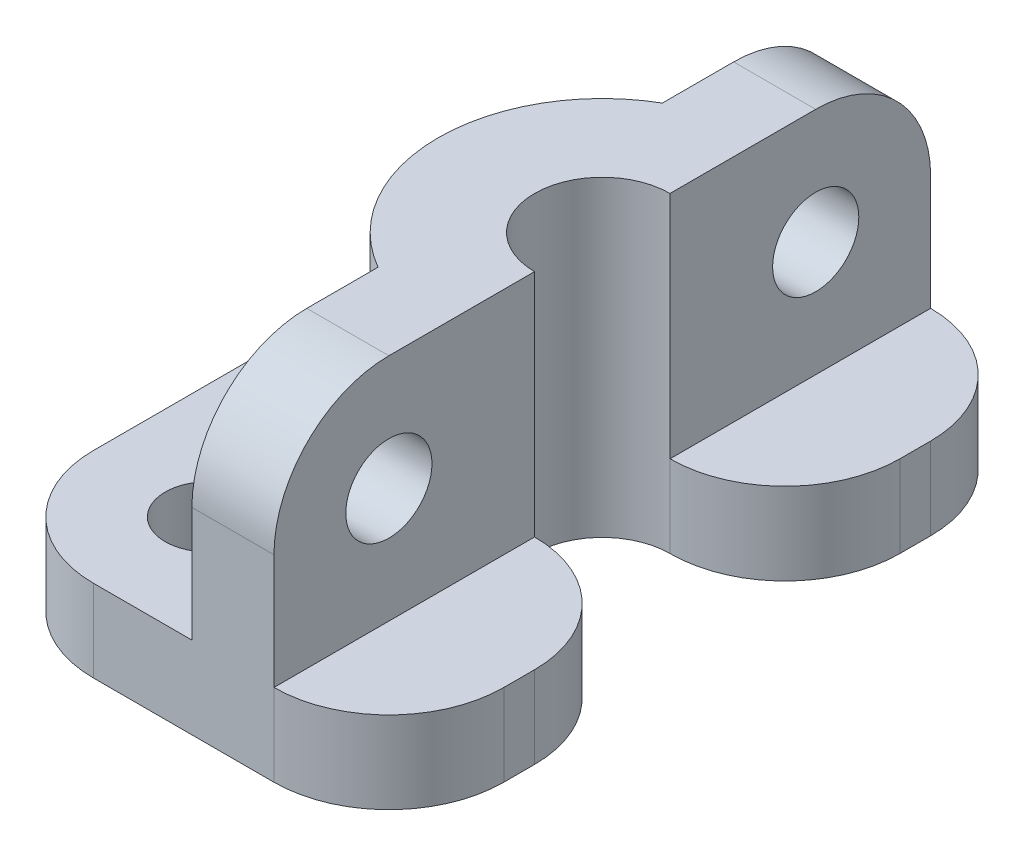
ISO-10303-21;
HEADER;
FILE_DESCRIPTION(('STEP AP214'),'2;1');
FILE_NAME('part.step','',(''),(''),'','','');
FILE_SCHEMA(('AUTOMOTIVE_DESIGN { 1 0 10303 214 1 1 1 1 }'));
ENDSEC;
DATA;
#1=APPLICATION_CONTEXT('core data for automotive mechanical design processes');
#2=APPLICATION_PROTOCOL_DEFINITION('international standard','automotive_design',2000,#1);
#3=PRODUCT_CONTEXT('',#1,'mechanical');
#4=PRODUCT('Part','Part','',(#3));
#5=PRODUCT_RELATED_PRODUCT_CATEGORY('part','',(#4));
#6=PRODUCT_DEFINITION_FORMATION('','',#4);
#7=PRODUCT_DEFINITION_CONTEXT('part definition',#1,'design');
#8=PRODUCT_DEFINITION('design','',#6,#7);
#9=PRODUCT_DEFINITION_SHAPE('','',#8);
#10=(LENGTH_UNIT() NAMED_UNIT(*) SI_UNIT(.MILLI.,.METRE.));
#11=(NAMED_UNIT(*) PLANE_ANGLE_UNIT() SI_UNIT($,.RADIAN.));
#12=(NAMED_UNIT(*) SI_UNIT($,.STERADIAN.) SOLID_ANGLE_UNIT());
#13=UNCERTAINTY_MEASURE_WITH_UNIT(LENGTH_MEASURE(1.E-05),#10,'distance_accuracy_value','');
#14=(GEOMETRIC_REPRESENTATION_CONTEXT(3) GLOBAL_UNCERTAINTY_ASSIGNED_CONTEXT((#13)) GLOBAL_UNIT_ASSIGNED_CONTEXT((#10,
#11,#12)) REPRESENTATION_CONTEXT('',''));
#15=CARTESIAN_POINT('',(0.,0.,0.));
#16=DIRECTION('',(0.,0.,1.));
#17=DIRECTION('',(1.,0.,0.));
#18=AXIS2_PLACEMENT_3D('',#15,#16,#17);
#19=CARTESIAN_POINT('',(9.,5.,20.));
#20=DIRECTION('',(0.,1.,0.));
#21=DIRECTION('',(0.,0.,1.));
#22=AXIS2_PLACEMENT_3D('',#19,#20,#21);
#23=PLANE('',#22);
#24=CARTESIAN_POINT('',(-2.,5.,-13.));
#25=DIRECTION('',(0.,1.,0.));
#26=DIRECTION('',(0.,0.,1.));
#27=AXIS2_PLACEMENT_3D('',#24,#25,#26);
#28=CIRCLE('',#27,2.625);
#29=CARTESIAN_POINT('',(-2.,5.,-10.375));
#30=VERTEX_POINT('',#29);
#31=EDGE_CURVE('E261',#30,#30,#28,.T.);
#32=ORIENTED_EDGE('',*,*,#31,.F.);
#33=EDGE_LOOP('',(#32));
#34=FACE_BOUND('',#33,.T.);
#35=DIRECTION('',(0.,0.,1.));
#36=VECTOR('',#35,1.);
#37=CARTESIAN_POINT('',(-9.,5.,-20.));
#38=LINE('',#37,#36);
#39=CARTESIAN_POINT('',(-9.,5.,-13.));
#40=VERTEX_POINT('',#39);
#41=CARTESIAN_POINT('',(-9.,5.,-2.5));
#42=VERTEX_POINT('',#41);
#43=EDGE_CURVE('E219',#40,#42,#38,.T.);
#44=ORIENTED_EDGE('',*,*,#43,.T.);
#45=DIRECTION('',(1.,0.,0.));
#46=VECTOR('',#45,1.);
#47=CARTESIAN_POINT('',(2.,5.,-2.5));
#48=LINE('',#47,#46);
#49=CARTESIAN_POINT('',(-0.682458365518541,5.,-2.5));
#50=VERTEX_POINT('',#49);
#51=EDGE_CURVE('E193',#42,#50,#48,.T.);
#52=ORIENTED_EDGE('',*,*,#51,.T.);
#53=CARTESIAN_POINT('',(9.,5.,0.));
#54=DIRECTION('',(0.,1.,0.));
#55=DIRECTION('',(0.,0.,1.));
#56=AXIS2_PLACEMENT_3D('',#53,#54,#55);
#57=CIRCLE('',#56,10.);
#58=CARTESIAN_POINT('',(4.00000000000001,5.,-8.66025403784439));
#59=VERTEX_POINT('',#58);
#60=EDGE_CURVE('E321',#59,#50,#57,.T.);
#61=ORIENTED_EDGE('',*,*,#60,.F.);
#62=DIRECTION('',(0.,0.,1.));
#63=VECTOR('',#62,1.);
#64=CARTESIAN_POINT('',(4.,5.,-20.));
#65=LINE('',#64,#63);
#66=CARTESIAN_POINT('',(4.00000000000001,5.,-20.));
#67=VERTEX_POINT('',#66);
#68=EDGE_CURVE('E308',#67,#59,#65,.T.);
#69=ORIENTED_EDGE('',*,*,#68,.F.);
#70=DIRECTION('',(-1.,0.,0.));
#71=VECTOR('',#70,1.);
#72=CARTESIAN_POINT('',(-9.,5.,-20.));
#73=LINE('',#72,#71);
#74=CARTESIAN_POINT('',(-2.,5.,-20.));
#75=VERTEX_POINT('',#74);
#76=EDGE_CURVE('E220',#67,#75,#73,.T.);
#77=ORIENTED_EDGE('',*,*,#76,.T.);
#78=CARTESIAN_POINT('',(-2.,5.,-13.));
#79=DIRECTION('',(0.,1.,0.));
#80=DIRECTION('',(0.,0.,1.));
#81=AXIS2_PLACEMENT_3D('',#78,#79,#80);
#82=CIRCLE('',#81,7.);
#83=EDGE_CURVE('E241',#75,#40,#82,.T.);
#84=ORIENTED_EDGE('',*,*,#83,.T.);
#85=EDGE_LOOP('',(#44,#52,#61,#69,#77,#84));
#86=FACE_BOUND('',#85,.T.);
#87=ADVANCED_FACE('F35',(#34,#86),#23,.T.);
#88=CARTESIAN_POINT('',(9.,19.,0.));
#89=DIRECTION('',(0.,-1.,0.));
#90=DIRECTION('',(0.,0.,-1.));
#91=AXIS2_PLACEMENT_3D('',#88,#89,#90);
#92=CYLINDRICAL_SURFACE('',#91,10.);
#93=DIRECTION('',(0.,-1.,0.));
#94=VECTOR('',#93,1.);
#95=CARTESIAN_POINT('',(-0.682458365518541,19.,-2.5));
#96=LINE('',#95,#94);
#97=CARTESIAN_POINT('',(-0.68245836551854,13.3175416344814,-2.5));
#98=VERTEX_POINT('',#97);
#99=EDGE_CURVE('E11',#98,#50,#96,.T.);
#100=ORIENTED_EDGE('',*,*,#99,.F.);
#101=CARTESIAN_POINT('',(9.,22.9999999999998,0.));
#102=DIRECTION('',(-0.707106781186544,0.707106781186551,0.));
#103=DIRECTION('',(-0.707106781186551,-0.707106781186544,0.));
#104=AXIS2_PLACEMENT_3D('',#101,#102,#103);
#105=ELLIPSE('',#104,14.1421356237309,10.);
#106=CARTESIAN_POINT('',(-0.68245836551854,13.3175416344814,2.5));
#107=VERTEX_POINT('',#106);
#108=EDGE_CURVE('E43',#98,#107,#105,.T.);
#109=ORIENTED_EDGE('',*,*,#108,.T.);
#110=DIRECTION('',(0.,-1.,0.));
#111=VECTOR('',#110,1.);
#112=CARTESIAN_POINT('',(-0.682458365518541,19.,2.5));
#113=LINE('',#112,#111);
#114=CARTESIAN_POINT('',(-0.682458365518541,5.,2.5));
#115=VERTEX_POINT('',#114);
#116=EDGE_CURVE('E190',#107,#115,#113,.T.);
#117=ORIENTED_EDGE('',*,*,#116,.T.);
#118=CARTESIAN_POINT('',(4.00000000000001,5.,8.66025403784439));
#119=VERTEX_POINT('',#118);
#120=EDGE_CURVE('E213',#115,#119,#57,.T.);
#121=ORIENTED_EDGE('',*,*,#120,.T.);
#122=DIRECTION('',(0.,-1.,0.));
#123=VECTOR('',#122,1.);
#124=CARTESIAN_POINT('',(4.00000000000001,19.,8.66025403784439));
#125=LINE('',#124,#123);
#126=CARTESIAN_POINT('',(4.00000000000001,19.,8.66025403784439));
#127=VERTEX_POINT('',#126);
#128=EDGE_CURVE('E326',#127,#119,#125,.T.);
#129=ORIENTED_EDGE('',*,*,#128,.F.);
#130=CARTESIAN_POINT('',(9.,19.,0.));
#131=DIRECTION('',(0.,1.,0.));
#132=DIRECTION('',(0.,0.,1.));
#133=AXIS2_PLACEMENT_3D('',#130,#131,#132);
#134=CIRCLE('',#133,10.);
#135=CARTESIAN_POINT('',(4.00000000000001,19.,-8.66025403784439));
#136=VERTEX_POINT('',#135);
#137=EDGE_CURVE('E315',#136,#127,#134,.T.);
#138=ORIENTED_EDGE('',*,*,#137,.F.);
#139=DIRECTION('',(0.,-1.,0.));
#140=VECTOR('',#139,1.);
#141=CARTESIAN_POINT('',(4.00000000000001,19.,-8.66025403784439));
#142=LINE('',#141,#140);
#143=EDGE_CURVE('E350',#136,#59,#142,.T.);
#144=ORIENTED_EDGE('',*,*,#143,.T.);
#145=ORIENTED_EDGE('',*,*,#60,.T.);
#146=EDGE_LOOP('',(#100,#109,#117,#121,#129,#138,#144,#145));
#147=FACE_BOUND('',#146,.T.);
#148=ADVANCED_FACE('F250',(#147),#92,.T.);
#149=CARTESIAN_POINT('',(9.,5.,-20.));
#150=DIRECTION('',(-1.,0.,0.));
#151=DIRECTION('',(0.,0.,1.));
#152=AXIS2_PLACEMENT_3D('',#149,#150,#151);
#153=PLANE('',#152);
#154=CARTESIAN_POINT('',(9.,12.,-13.));
#155=DIRECTION('',(1.,0.,0.));
#156=DIRECTION('',(0.,0.,1.));
#157=AXIS2_PLACEMENT_3D('',#154,#155,#156);
#158=CIRCLE('',#157,2.625);
#159=CARTESIAN_POINT('',(9.,12.,-10.375));
#160=VERTEX_POINT('',#159);
#161=EDGE_CURVE('E288',#160,#160,#158,.T.);
#162=ORIENTED_EDGE('',*,*,#161,.F.);
#163=EDGE_LOOP('',(#162));
#164=FACE_BOUND('',#163,.T.);
#165=DIRECTION('',(0.,0.,1.));
#166=VECTOR('',#165,1.);
#167=CARTESIAN_POINT('',(9.,5.,-20.));
#168=LINE('',#167,#166);
#169=CARTESIAN_POINT('',(9.,5.,-20.));
#170=VERTEX_POINT('',#169);
#171=CARTESIAN_POINT('',(9.,5.,-4.125));
#172=VERTEX_POINT('',#171);
#173=EDGE_CURVE('E267',#170,#172,#168,.T.);
#174=ORIENTED_EDGE('',*,*,#173,.F.);
#175=DIRECTION('',(0.,-1.,0.));
#176=VECTOR('',#175,1.);
#177=CARTESIAN_POINT('',(9.,5.,-20.));
#178=LINE('',#177,#176);
#179=CARTESIAN_POINT('',(9.,12.,-20.));
#180=VERTEX_POINT('',#179);
#181=EDGE_CURVE('E423',#180,#170,#178,.T.);
#182=ORIENTED_EDGE('',*,*,#181,.F.);
#183=CARTESIAN_POINT('',(9.,12.,-13.));
#184=DIRECTION('',(-1.,0.,0.));
#185=DIRECTION('',(0.,0.,1.));
#186=AXIS2_PLACEMENT_3D('',#183,#184,#185);
#187=CIRCLE('',#186,7.);
#188=CARTESIAN_POINT('',(9.,19.,-13.));
#189=VERTEX_POINT('',#188);
#190=EDGE_CURVE('E354',#180,#189,#187,.F.);
#191=ORIENTED_EDGE('',*,*,#190,.T.);
#192=DIRECTION('',(0.,0.,-1.));
#193=VECTOR('',#192,1.);
#194=CARTESIAN_POINT('',(9.,19.,20.));
#195=LINE('',#194,#193);
#196=CARTESIAN_POINT('',(9.,19.,-4.125));
#197=VERTEX_POINT('',#196);
#198=EDGE_CURVE('E313',#197,#189,#195,.T.);
#199=ORIENTED_EDGE('',*,*,#198,.F.);
#200=DIRECTION('',(0.,1.,0.));
#201=VECTOR('',#200,1.);
#202=CARTESIAN_POINT('',(9.,0.,-4.125));
#203=LINE('',#202,#201);
#204=EDGE_CURVE('E301',#197,#172,#203,.F.);
#205=ORIENTED_EDGE('',*,*,#204,.T.);
#206=EDGE_LOOP('',(#174,#182,#191,#199,#205));
#207=FACE_BOUND('',#206,.T.);
#208=ADVANCED_FACE('F459',(#164,#207),#153,.F.);
#209=CARTESIAN_POINT('',(9.,12.,13.));
#210=DIRECTION('',(1.,0.,0.));
#211=DIRECTION('',(0.,0.,-1.));
#212=AXIS2_PLACEMENT_3D('',#209,#210,#211);
#213=CIRCLE('',#212,2.625);
#214=CARTESIAN_POINT('',(9.,12.,10.375));
#215=VERTEX_POINT('',#214);
#216=EDGE_CURVE('E294',#215,#215,#213,.T.);
#217=ORIENTED_EDGE('',*,*,#216,.F.);
#218=EDGE_LOOP('',(#217));
#219=FACE_BOUND('',#218,.T.);
#220=DIRECTION('',(0.,0.,1.));
#221=VECTOR('',#220,1.);
#222=CARTESIAN_POINT('',(9.00000000000001,5.,20.));
#223=LINE('',#222,#221);
#224=CARTESIAN_POINT('',(9.,5.,4.12500000000002));
#225=VERTEX_POINT('',#224);
#226=CARTESIAN_POINT('',(9.,5.,20.));
#227=VERTEX_POINT('',#226);
#228=EDGE_CURVE('E277',#225,#227,#223,.T.);
#229=ORIENTED_EDGE('',*,*,#228,.F.);
#230=DIRECTION('',(0.,1.,0.));
#231=VECTOR('',#230,1.);
#232=CARTESIAN_POINT('',(9.,0.,4.125));
#233=LINE('',#232,#231);
#234=CARTESIAN_POINT('',(9.,19.,4.125));
#235=VERTEX_POINT('',#234);
#236=EDGE_CURVE('E304',#225,#235,#233,.T.);
#237=ORIENTED_EDGE('',*,*,#236,.T.);
#238=CARTESIAN_POINT('',(9.,19.,13.));
#239=VERTEX_POINT('',#238);
#240=EDGE_CURVE('E309',#239,#235,#195,.T.);
#241=ORIENTED_EDGE('',*,*,#240,.F.);
#242=CARTESIAN_POINT('',(9.,12.,13.));
#243=DIRECTION('',(-1.,0.,0.));
#244=DIRECTION('',(0.,0.,1.));
#245=AXIS2_PLACEMENT_3D('',#242,#243,#244);
#246=CIRCLE('',#245,7.);
#247=CARTESIAN_POINT('',(9.,12.,20.));
#248=VERTEX_POINT('',#247);
#249=EDGE_CURVE('E341',#239,#248,#246,.F.);
#250=ORIENTED_EDGE('',*,*,#249,.T.);
#251=DIRECTION('',(0.,-1.,0.));
#252=VECTOR('',#251,1.);
#253=CARTESIAN_POINT('',(9.,5.,20.));
#254=LINE('',#253,#252);
#255=EDGE_CURVE('E237',#248,#227,#254,.T.);
#256=ORIENTED_EDGE('',*,*,#255,.T.);
#257=EDGE_LOOP('',(#229,#237,#241,#250,#256));
#258=FACE_BOUND('',#257,.T.);
#259=ADVANCED_FACE('F528',(#219,#258),#153,.F.);
#260=CARTESIAN_POINT('',(-9.,5.,-20.));
#261=DIRECTION('',(0.,0.,1.));
#262=DIRECTION('',(1.,0.,0.));
#263=AXIS2_PLACEMENT_3D('',#260,#261,#262);
#264=PLANE('',#263);
#265=DIRECTION('',(-1.,0.,0.));
#266=VECTOR('',#265,1.);
#267=CARTESIAN_POINT('',(-9.,0.,-20.));
#268=LINE('',#267,#266);
#269=CARTESIAN_POINT('',(9.,0.,-20.));
#270=VERTEX_POINT('',#269);
#271=CARTESIAN_POINT('',(-2.,0.,-20.));
#272=VERTEX_POINT('',#271);
#273=EDGE_CURVE('E232',#270,#272,#268,.T.);
#274=ORIENTED_EDGE('',*,*,#273,.T.);
#275=DIRECTION('',(0.,-1.,0.));
#276=VECTOR('',#275,1.);
#277=CARTESIAN_POINT('',(-2.,5.,-20.));
#278=LINE('',#277,#276);
#279=EDGE_CURVE('E238',#272,#75,#278,.F.);
#280=ORIENTED_EDGE('',*,*,#279,.T.);
#281=ORIENTED_EDGE('',*,*,#76,.F.);
#282=DIRECTION('',(0.,-1.,0.));
#283=VECTOR('',#282,1.);
#284=CARTESIAN_POINT('',(4.,19.,-20.));
#285=LINE('',#284,#283);
#286=CARTESIAN_POINT('',(4.,12.,-20.));
#287=VERTEX_POINT('',#286);
#288=EDGE_CURVE('E348',#287,#67,#285,.T.);
#289=ORIENTED_EDGE('',*,*,#288,.F.);
#290=DIRECTION('',(-1.,0.,0.));
#291=VECTOR('',#290,1.);
#292=CARTESIAN_POINT('',(9.,12.,-20.));
#293=LINE('',#292,#291);
#294=EDGE_CURVE('E352',#287,#180,#293,.F.);
#295=ORIENTED_EDGE('',*,*,#294,.T.);
#296=ORIENTED_EDGE('',*,*,#181,.T.);
#297=DIRECTION('',(0.,1.,0.));
#298=VECTOR('',#297,1.);
#299=CARTESIAN_POINT('',(9.,5.,-20.));
#300=LINE('',#299,#298);
#301=EDGE_CURVE('E395',#170,#270,#300,.F.);
#302=ORIENTED_EDGE('',*,*,#301,.T.);
#303=EDGE_LOOP('',(#274,#280,#281,#289,#295,#296,#302));
#304=FACE_BOUND('',#303,.T.);
#305=ADVANCED_FACE('F403',(#304),#264,.F.);
#306=CARTESIAN_POINT('',(-9.,5.,-20.));
#307=DIRECTION('',(1.,0.,0.));
#308=DIRECTION('',(0.,0.,-1.));
#309=AXIS2_PLACEMENT_3D('',#306,#307,#308);
#310=PLANE('',#309);
#311=ORIENTED_EDGE('',*,*,#43,.F.);
#312=DIRECTION('',(0.,-1.,0.));
#313=VECTOR('',#312,1.);
#314=CARTESIAN_POINT('',(-9.,5.,-13.));
#315=LINE('',#314,#313);
#316=CARTESIAN_POINT('',(-9.,0.,-13.));
#317=VERTEX_POINT('',#316);
#318=EDGE_CURVE('E393',#40,#317,#315,.T.);
#319=ORIENTED_EDGE('',*,*,#318,.T.);
#320=DIRECTION('',(0.,0.,1.));
#321=VECTOR('',#320,1.);
#322=CARTESIAN_POINT('',(-9.,0.,-20.));
#323=LINE('',#322,#321);
#324=CARTESIAN_POINT('',(-9.,0.,13.));
#325=VERTEX_POINT('',#324);
#326=EDGE_CURVE('E413',#317,#325,#323,.T.);
#327=ORIENTED_EDGE('',*,*,#326,.T.);
#328=DIRECTION('',(0.,-1.,0.));
#329=VECTOR('',#328,1.);
#330=CARTESIAN_POINT('',(-9.,5.,13.));
#331=LINE('',#330,#329);
#332=CARTESIAN_POINT('',(-9.,5.,13.));
#333=VERTEX_POINT('',#332);
#334=EDGE_CURVE('E218',#325,#333,#331,.F.);
#335=ORIENTED_EDGE('',*,*,#334,.T.);
#336=CARTESIAN_POINT('',(-9.,5.,2.5));
#337=VERTEX_POINT('',#336);
#338=EDGE_CURVE('E210',#337,#333,#38,.T.);
#339=ORIENTED_EDGE('',*,*,#338,.F.);
#340=DIRECTION('',(0.,0.,1.));
#341=VECTOR('',#340,1.);
#342=CARTESIAN_POINT('',(-9.,5.,-2.5));
#343=LINE('',#342,#341);
#344=EDGE_CURVE('E196',#42,#337,#343,.T.);
#345=ORIENTED_EDGE('',*,*,#344,.F.);
#346=EDGE_LOOP('',(#311,#319,#327,#335,#339,#345));
#347=FACE_BOUND('',#346,.T.);
#348=ADVANCED_FACE('F215',(#347),#310,.F.);
#349=CARTESIAN_POINT('',(-9.,5.,20.));
#350=DIRECTION('',(0.,0.,-1.));
#351=DIRECTION('',(-1.,0.,0.));
#352=AXIS2_PLACEMENT_3D('',#349,#350,#351);
#353=PLANE('',#352);
#354=DIRECTION('',(1.,0.,0.));
#355=VECTOR('',#354,1.);
#356=CARTESIAN_POINT('',(-9.,0.,20.));
#357=LINE('',#356,#355);
#358=CARTESIAN_POINT('',(-2.,0.,20.));
#359=VERTEX_POINT('',#358);
#360=CARTESIAN_POINT('',(9.,0.,20.));
#361=VERTEX_POINT('',#360);
#362=EDGE_CURVE('E224',#359,#361,#357,.T.);
#363=ORIENTED_EDGE('',*,*,#362,.T.);
#364=DIRECTION('',(0.,-1.,0.));
#365=VECTOR('',#364,1.);
#366=CARTESIAN_POINT('',(9.,5.,20.));
#367=LINE('',#366,#365);
#368=EDGE_CURVE('E246',#361,#227,#367,.F.);
#369=ORIENTED_EDGE('',*,*,#368,.T.);
#370=ORIENTED_EDGE('',*,*,#255,.F.);
#371=DIRECTION('',(1.,0.,0.));
#372=VECTOR('',#371,1.);
#373=CARTESIAN_POINT('',(4.00000000000001,12.,20.));
#374=LINE('',#373,#372);
#375=CARTESIAN_POINT('',(4.00000000000001,12.,20.));
#376=VERTEX_POINT('',#375);
#377=EDGE_CURVE('E343',#248,#376,#374,.F.);
#378=ORIENTED_EDGE('',*,*,#377,.T.);
#379=DIRECTION('',(0.,-1.,0.));
#380=VECTOR('',#379,1.);
#381=CARTESIAN_POINT('',(4.00000000000001,19.,20.));
#382=LINE('',#381,#380);
#383=CARTESIAN_POINT('',(4.00000000000001,5.,20.));
#384=VERTEX_POINT('',#383);
#385=EDGE_CURVE('E320',#376,#384,#382,.T.);
#386=ORIENTED_EDGE('',*,*,#385,.T.);
#387=DIRECTION('',(1.,0.,0.));
#388=VECTOR('',#387,1.);
#389=CARTESIAN_POINT('',(-9.,5.,20.));
#390=LINE('',#389,#388);
#391=CARTESIAN_POINT('',(-2.,5.,20.));
#392=VERTEX_POINT('',#391);
#393=EDGE_CURVE('E222',#392,#384,#390,.T.);
#394=ORIENTED_EDGE('',*,*,#393,.F.);
#395=DIRECTION('',(0.,-1.,0.));
#396=VECTOR('',#395,1.);
#397=CARTESIAN_POINT('',(-2.,5.,20.));
#398=LINE('',#397,#396);
#399=EDGE_CURVE('E243',#392,#359,#398,.T.);
#400=ORIENTED_EDGE('',*,*,#399,.T.);
#401=EDGE_LOOP('',(#363,#369,#370,#378,#386,#394,#400));
#402=FACE_BOUND('',#401,.T.);
#403=ADVANCED_FACE('F488',(#402),#353,.F.);
#404=DIRECTION('',(1.,0.,0.));
#405=VECTOR('',#404,1.);
#406=CARTESIAN_POINT('',(2.,5.,2.5));
#407=LINE('',#406,#405);
#408=EDGE_CURVE('E50',#337,#115,#407,.T.);
#409=ORIENTED_EDGE('',*,*,#408,.F.);
#410=ORIENTED_EDGE('',*,*,#338,.T.);
#411=CARTESIAN_POINT('',(-2.,5.,13.));
#412=DIRECTION('',(0.,1.,0.));
#413=DIRECTION('',(0.,0.,1.));
#414=AXIS2_PLACEMENT_3D('',#411,#412,#413);
#415=CIRCLE('',#414,7.);
#416=EDGE_CURVE('E58',#333,#392,#415,.T.);
#417=ORIENTED_EDGE('',*,*,#416,.T.);
#418=ORIENTED_EDGE('',*,*,#393,.T.);
#419=DIRECTION('',(0.,0.,1.));
#420=VECTOR('',#419,1.);
#421=CARTESIAN_POINT('',(4.00000000000001,5.,20.));
#422=LINE('',#421,#420);
#423=EDGE_CURVE('E323',#119,#384,#422,.T.);
#424=ORIENTED_EDGE('',*,*,#423,.F.);
#425=ORIENTED_EDGE('',*,*,#120,.F.);
#426=EDGE_LOOP('',(#409,#410,#417,#418,#424,#425));
#427=FACE_BOUND('',#426,.T.);
#428=CARTESIAN_POINT('',(-2.,5.,13.));
#429=DIRECTION('',(0.,1.,0.));
#430=DIRECTION('',(0.,0.,-1.));
#431=AXIS2_PLACEMENT_3D('',#428,#429,#430);
#432=CIRCLE('',#431,2.625);
#433=CARTESIAN_POINT('',(-2.,5.,10.375));
#434=VERTEX_POINT('',#433);
#435=EDGE_CURVE('E205',#434,#434,#432,.T.);
#436=ORIENTED_EDGE('',*,*,#435,.F.);
#437=EDGE_LOOP('',(#436));
#438=FACE_BOUND('',#437,.T.);
#439=ADVANCED_FACE('F208',(#427,#438),#23,.T.);
#440=CARTESIAN_POINT('',(9.,0.,20.));
#441=DIRECTION('',(0.,1.,0.));
#442=DIRECTION('',(0.,0.,1.));
#443=AXIS2_PLACEMENT_3D('',#440,#441,#442);
#444=PLANE('',#443);
#445=CARTESIAN_POINT('',(-2.,0.,13.));
#446=DIRECTION('',(0.,1.,0.));
#447=DIRECTION('',(0.,0.,-1.));
#448=AXIS2_PLACEMENT_3D('',#445,#446,#447);
#449=CIRCLE('',#448,2.625);
#450=CARTESIAN_POINT('',(-2.,0.,10.375));
#451=VERTEX_POINT('',#450);
#452=EDGE_CURVE('E258',#451,#451,#449,.T.);
#453=ORIENTED_EDGE('',*,*,#452,.T.);
#454=EDGE_LOOP('',(#453));
#455=FACE_BOUND('',#454,.T.);
#456=CARTESIAN_POINT('',(-2.,0.,-13.));
#457=DIRECTION('',(0.,1.,0.));
#458=DIRECTION('',(0.,0.,1.));
#459=AXIS2_PLACEMENT_3D('',#456,#457,#458);
#460=CIRCLE('',#459,2.625);
#461=CARTESIAN_POINT('',(-2.,0.,-10.375));
#462=VERTEX_POINT('',#461);
#463=EDGE_CURVE('E264',#462,#462,#460,.T.);
#464=ORIENTED_EDGE('',*,*,#463,.T.);
#465=EDGE_LOOP('',(#464));
#466=FACE_BOUND('',#465,.T.);
#467=DIRECTION('',(0.,0.,-1.));
#468=VECTOR('',#467,1.);
#469=CARTESIAN_POINT('',(16.,0.,-20.));
#470=LINE('',#469,#468);
#471=CARTESIAN_POINT('',(16.,0.,-11.125));
#472=VERTEX_POINT('',#471);
#473=CARTESIAN_POINT('',(16.,0.,-13.));
#474=VERTEX_POINT('',#473);
#475=EDGE_CURVE('E270',#472,#474,#470,.T.);
#476=ORIENTED_EDGE('',*,*,#475,.F.);
#477=CARTESIAN_POINT('',(9.,0.,-11.125));
#478=DIRECTION('',(0.,1.,0.));
#479=DIRECTION('',(0.,0.,1.));
#480=AXIS2_PLACEMENT_3D('',#477,#478,#479);
#481=CIRCLE('',#480,7.);
#482=CARTESIAN_POINT('',(9.,0.,-4.12500000000002));
#483=VERTEX_POINT('',#482);
#484=EDGE_CURVE('E376',#472,#483,#481,.F.);
#485=ORIENTED_EDGE('',*,*,#484,.T.);
#486=CARTESIAN_POINT('',(9.,0.,0.));
#487=DIRECTION('',(0.,1.,0.));
#488=DIRECTION('',(0.,0.,1.));
#489=AXIS2_PLACEMENT_3D('',#486,#487,#488);
#490=CIRCLE('',#489,4.125);
#491=CARTESIAN_POINT('',(9.,0.,4.125));
#492=VERTEX_POINT('',#491);
#493=EDGE_CURVE('E298',#483,#492,#490,.T.);
#494=ORIENTED_EDGE('',*,*,#493,.T.);
#495=CARTESIAN_POINT('',(9.,0.,11.125));
#496=DIRECTION('',(0.,1.,0.));
#497=DIRECTION('',(0.,0.,1.));
#498=AXIS2_PLACEMENT_3D('',#495,#496,#497);
#499=CIRCLE('',#498,7.);
#500=CARTESIAN_POINT('',(16.,0.,11.125));
#501=VERTEX_POINT('',#500);
#502=EDGE_CURVE('E374',#492,#501,#499,.F.);
#503=ORIENTED_EDGE('',*,*,#502,.T.);
#504=DIRECTION('',(0.,0.,-1.));
#505=VECTOR('',#504,1.);
#506=CARTESIAN_POINT('',(16.,0.,20.));
#507=LINE('',#506,#505);
#508=CARTESIAN_POINT('',(16.,0.,13.));
#509=VERTEX_POINT('',#508);
#510=EDGE_CURVE('E282',#509,#501,#507,.T.);
#511=ORIENTED_EDGE('',*,*,#510,.F.);
#512=CARTESIAN_POINT('',(9.,0.,13.));
#513=DIRECTION('',(0.,1.,0.));
#514=DIRECTION('',(0.,0.,1.));
#515=AXIS2_PLACEMENT_3D('',#512,#513,#514);
#516=CIRCLE('',#515,7.);
#517=EDGE_CURVE('E368',#509,#361,#516,.F.);
#518=ORIENTED_EDGE('',*,*,#517,.T.);
#519=ORIENTED_EDGE('',*,*,#362,.F.);
#520=CARTESIAN_POINT('',(-2.,0.,13.));
#521=DIRECTION('',(0.,1.,0.));
#522=DIRECTION('',(0.,0.,1.));
#523=AXIS2_PLACEMENT_3D('',#520,#521,#522);
#524=CIRCLE('',#523,7.);
#525=EDGE_CURVE('E366',#359,#325,#524,.F.);
#526=ORIENTED_EDGE('',*,*,#525,.T.);
#527=ORIENTED_EDGE('',*,*,#326,.F.);
#528=CARTESIAN_POINT('',(-2.,0.,-13.));
#529=DIRECTION('',(0.,1.,0.));
#530=DIRECTION('',(0.,0.,1.));
#531=AXIS2_PLACEMENT_3D('',#528,#529,#530);
#532=CIRCLE('',#531,7.);
#533=EDGE_CURVE('E372',#317,#272,#532,.F.);
#534=ORIENTED_EDGE('',*,*,#533,.T.);
#535=ORIENTED_EDGE('',*,*,#273,.F.);
#536=CARTESIAN_POINT('',(9.,0.,-13.));
#537=DIRECTION('',(0.,1.,0.));
#538=DIRECTION('',(0.,0.,1.));
#539=AXIS2_PLACEMENT_3D('',#536,#537,#538);
#540=CIRCLE('',#539,7.);
#541=EDGE_CURVE('E370',#270,#474,#540,.F.);
#542=ORIENTED_EDGE('',*,*,#541,.T.);
#543=EDGE_LOOP('',(#476,#485,#494,#503,#511,#518,#519,#526,#527,#534,#535,#542));
#544=FACE_BOUND('',#543,.T.);
#545=ADVANCED_FACE('F416',(#455,#466,#544),#444,.F.);
#546=CARTESIAN_POINT('',(4.,19.,-20.));
#547=DIRECTION('',(1.,0.,0.));
#548=DIRECTION('',(0.,0.,-1.));
#549=AXIS2_PLACEMENT_3D('',#546,#547,#548);
#550=PLANE('',#549);
#551=CARTESIAN_POINT('',(4.00000000000001,12.,-13.));
#552=DIRECTION('',(1.,0.,0.));
#553=DIRECTION('',(0.,0.,-1.));
#554=AXIS2_PLACEMENT_3D('',#551,#552,#553);
#555=CIRCLE('',#554,2.625);
#556=CARTESIAN_POINT('',(4.,12.,-15.625));
#557=VERTEX_POINT('',#556);
#558=EDGE_CURVE('E293',#557,#557,#555,.T.);
#559=ORIENTED_EDGE('',*,*,#558,.T.);
#560=EDGE_LOOP('',(#559));
#561=FACE_BOUND('',#560,.T.);
#562=DIRECTION('',(0.,0.,1.));
#563=VECTOR('',#562,1.);
#564=CARTESIAN_POINT('',(4.,19.,-20.));
#565=LINE('',#564,#563);
#566=CARTESIAN_POINT('',(4.00000000000001,19.,-13.));
#567=VERTEX_POINT('',#566);
#568=EDGE_CURVE('E312',#567,#136,#565,.T.);
#569=ORIENTED_EDGE('',*,*,#568,.F.);
#570=CARTESIAN_POINT('',(4.00000000000001,12.,-13.));
#571=DIRECTION('',(1.,0.,0.));
#572=DIRECTION('',(0.,0.,-1.));
#573=AXIS2_PLACEMENT_3D('',#570,#571,#572);
#574=CIRCLE('',#573,7.);
#575=EDGE_CURVE('E347',#567,#287,#574,.F.);
#576=ORIENTED_EDGE('',*,*,#575,.T.);
#577=ORIENTED_EDGE('',*,*,#288,.T.);
#578=ORIENTED_EDGE('',*,*,#68,.T.);
#579=ORIENTED_EDGE('',*,*,#143,.F.);
#580=EDGE_LOOP('',(#569,#576,#577,#578,#579));
#581=FACE_BOUND('',#580,.T.);
#582=ADVANCED_FACE('F437',(#561,#581),#550,.F.);
#583=CARTESIAN_POINT('',(4.00000000000001,19.,20.));
#584=DIRECTION('',(1.,0.,0.));
#585=DIRECTION('',(0.,0.,-1.));
#586=AXIS2_PLACEMENT_3D('',#583,#584,#585);
#587=PLANE('',#586);
#588=CARTESIAN_POINT('',(4.00000000000001,12.,13.));
#589=DIRECTION('',(1.,0.,0.));
#590=DIRECTION('',(0.,0.,-1.));
#591=AXIS2_PLACEMENT_3D('',#588,#589,#590);
#592=CIRCLE('',#591,2.625);
#593=CARTESIAN_POINT('',(4.00000000000001,12.,10.375));
#594=VERTEX_POINT('',#593);
#595=EDGE_CURVE('E297',#594,#594,#592,.T.);
#596=ORIENTED_EDGE('',*,*,#595,.T.);
#597=EDGE_LOOP('',(#596));
#598=FACE_BOUND('',#597,.T.);
#599=ORIENTED_EDGE('',*,*,#385,.F.);
#600=CARTESIAN_POINT('',(4.00000000000001,12.,13.));
#601=DIRECTION('',(1.,0.,0.));
#602=DIRECTION('',(0.,0.,-1.));
#603=AXIS2_PLACEMENT_3D('',#600,#601,#602);
#604=CIRCLE('',#603,7.);
#605=CARTESIAN_POINT('',(4.00000000000001,19.,13.));
#606=VERTEX_POINT('',#605);
#607=EDGE_CURVE('E345',#376,#606,#604,.F.);
#608=ORIENTED_EDGE('',*,*,#607,.T.);
#609=DIRECTION('',(0.,0.,1.));
#610=VECTOR('',#609,1.);
#611=CARTESIAN_POINT('',(4.00000000000001,19.,20.));
#612=LINE('',#611,#610);
#613=EDGE_CURVE('E317',#127,#606,#612,.T.);
#614=ORIENTED_EDGE('',*,*,#613,.F.);
#615=ORIENTED_EDGE('',*,*,#128,.T.);
#616=ORIENTED_EDGE('',*,*,#423,.T.);
#617=EDGE_LOOP('',(#599,#608,#614,#615,#616));
#618=FACE_BOUND('',#617,.T.);
#619=ADVANCED_FACE('F435',(#598,#618),#587,.F.);
#620=CARTESIAN_POINT('',(9.,19.,0.));
#621=DIRECTION('',(0.,1.,0.));
#622=DIRECTION('',(0.,0.,1.));
#623=AXIS2_PLACEMENT_3D('',#620,#621,#622);
#624=PLANE('',#623);
#625=ORIENTED_EDGE('',*,*,#613,.T.);
#626=DIRECTION('',(1.,0.,0.));
#627=VECTOR('',#626,1.);
#628=CARTESIAN_POINT('',(9.,19.,13.));
#629=LINE('',#628,#627);
#630=EDGE_CURVE('E448',#606,#239,#629,.T.);
#631=ORIENTED_EDGE('',*,*,#630,.T.);
#632=ORIENTED_EDGE('',*,*,#240,.T.);
#633=CARTESIAN_POINT('',(9.,19.,0.));
#634=DIRECTION('',(0.,1.,0.));
#635=DIRECTION('',(0.,0.,1.));
#636=AXIS2_PLACEMENT_3D('',#633,#634,#635);
#637=CIRCLE('',#636,4.125);
#638=EDGE_CURVE('E335',#197,#235,#637,.T.);
#639=ORIENTED_EDGE('',*,*,#638,.F.);
#640=ORIENTED_EDGE('',*,*,#198,.T.);
#641=DIRECTION('',(-1.,0.,0.));
#642=VECTOR('',#641,1.);
#643=CARTESIAN_POINT('',(4.,19.,-13.));
#644=LINE('',#643,#642);
#645=EDGE_CURVE('E443',#189,#567,#644,.T.);
#646=ORIENTED_EDGE('',*,*,#645,.T.);
#647=ORIENTED_EDGE('',*,*,#568,.T.);
#648=ORIENTED_EDGE('',*,*,#137,.T.);
#649=EDGE_LOOP('',(#625,#631,#632,#639,#640,#646,#647,#648));
#650=FACE_BOUND('',#649,.T.);
#651=ADVANCED_FACE('F440',(#650),#624,.T.);
#652=CARTESIAN_POINT('',(9.,0.,0.));
#653=DIRECTION('',(0.,1.,0.));
#654=DIRECTION('',(0.,0.,1.));
#655=AXIS2_PLACEMENT_3D('',#652,#653,#654);
#656=CYLINDRICAL_SURFACE('',#655,4.125);
#657=ORIENTED_EDGE('',*,*,#493,.F.);
#658=DIRECTION('',(0.,-1.,0.));
#659=VECTOR('',#658,1.);
#660=CARTESIAN_POINT('',(9.,0.,-4.12500000000002));
#661=LINE('',#660,#659);
#662=EDGE_CURVE('E274',#172,#483,#661,.T.);
#663=ORIENTED_EDGE('',*,*,#662,.F.);
#664=ORIENTED_EDGE('',*,*,#204,.F.);
#665=ORIENTED_EDGE('',*,*,#638,.T.);
#666=ORIENTED_EDGE('',*,*,#236,.F.);
#667=EDGE_CURVE('E305',#492,#225,#233,.T.);
#668=ORIENTED_EDGE('',*,*,#667,.F.);
#669=EDGE_LOOP('',(#657,#663,#664,#665,#666,#668));
#670=FACE_BOUND('',#669,.T.);
#671=ADVANCED_FACE('F454',(#670),#656,.F.);
#672=CARTESIAN_POINT('',(9.,12.,13.));
#673=DIRECTION('',(-1.,0.,0.));
#674=DIRECTION('',(0.,0.,1.));
#675=AXIS2_PLACEMENT_3D('',#672,#673,#674);
#676=CYLINDRICAL_SURFACE('',#675,7.);
#677=ORIENTED_EDGE('',*,*,#607,.F.);
#678=ORIENTED_EDGE('',*,*,#377,.F.);
#679=ORIENTED_EDGE('',*,*,#249,.F.);
#680=ORIENTED_EDGE('',*,*,#630,.F.);
#681=EDGE_LOOP('',(#677,#678,#679,#680));
#682=FACE_BOUND('',#681,.T.);
#683=ADVANCED_FACE('F532',(#682),#676,.T.);
#684=CARTESIAN_POINT('',(9.,12.,-13.));
#685=DIRECTION('',(1.,0.,0.));
#686=DIRECTION('',(0.,0.,-1.));
#687=AXIS2_PLACEMENT_3D('',#684,#685,#686);
#688=CYLINDRICAL_SURFACE('',#687,7.);
#689=ORIENTED_EDGE('',*,*,#190,.F.);
#690=ORIENTED_EDGE('',*,*,#294,.F.);
#691=ORIENTED_EDGE('',*,*,#575,.F.);
#692=ORIENTED_EDGE('',*,*,#645,.F.);
#693=EDGE_LOOP('',(#689,#690,#691,#692));
#694=FACE_BOUND('',#693,.T.);
#695=ADVANCED_FACE('F462',(#694),#688,.T.);
#696=CARTESIAN_POINT('',(-9.000025,12.,13.));
#697=DIRECTION('',(1.,0.,0.));
#698=DIRECTION('',(0.,0.,-1.));
#699=AXIS2_PLACEMENT_3D('',#696,#697,#698);
#700=CYLINDRICAL_SURFACE('',#699,2.625);
#701=ORIENTED_EDGE('',*,*,#216,.T.);
#702=EDGE_LOOP('',(#701));
#703=FACE_BOUND('',#702,.T.);
#704=ORIENTED_EDGE('',*,*,#595,.F.);
#705=EDGE_LOOP('',(#704));
#706=FACE_BOUND('',#705,.T.);
#707=ADVANCED_FACE('F538',(#703,#706),#700,.F.);
#708=CARTESIAN_POINT('',(-9.000025,12.,-13.));
#709=DIRECTION('',(1.,0.,0.));
#710=DIRECTION('',(0.,0.,-1.));
#711=AXIS2_PLACEMENT_3D('',#708,#709,#710);
#712=CYLINDRICAL_SURFACE('',#711,2.625);
#713=ORIENTED_EDGE('',*,*,#161,.T.);
#714=EDGE_LOOP('',(#713));
#715=FACE_BOUND('',#714,.T.);
#716=ORIENTED_EDGE('',*,*,#558,.F.);
#717=EDGE_LOOP('',(#716));
#718=FACE_BOUND('',#717,.T.);
#719=ADVANCED_FACE('F629',(#715,#718),#712,.F.);
#720=CARTESIAN_POINT('',(16.,5.,20.));
#721=DIRECTION('',(0.,-1.,0.));
#722=DIRECTION('',(0.,0.,-1.));
#723=AXIS2_PLACEMENT_3D('',#720,#721,#722);
#724=PLANE('',#723);
#725=DIRECTION('',(0.,0.,1.));
#726=VECTOR('',#725,1.);
#727=CARTESIAN_POINT('',(16.,5.,20.));
#728=LINE('',#727,#726);
#729=CARTESIAN_POINT('',(16.,5.,11.125));
#730=VERTEX_POINT('',#729);
#731=CARTESIAN_POINT('',(16.,5.,13.));
#732=VERTEX_POINT('',#731);
#733=EDGE_CURVE('E285',#730,#732,#728,.T.);
#734=ORIENTED_EDGE('',*,*,#733,.F.);
#735=CARTESIAN_POINT('',(9.,5.,11.125));
#736=DIRECTION('',(0.,-1.,0.));
#737=DIRECTION('',(0.,0.,-1.));
#738=AXIS2_PLACEMENT_3D('',#735,#736,#737);
#739=CIRCLE('',#738,7.);
#740=EDGE_CURVE('E390',#730,#225,#739,.F.);
#741=ORIENTED_EDGE('',*,*,#740,.T.);
#742=ORIENTED_EDGE('',*,*,#228,.T.);
#743=CARTESIAN_POINT('',(9.,5.,13.));
#744=DIRECTION('',(0.,-1.,0.));
#745=DIRECTION('',(0.,0.,-1.));
#746=AXIS2_PLACEMENT_3D('',#743,#744,#745);
#747=CIRCLE('',#746,7.);
#748=EDGE_CURVE('E388',#227,#732,#747,.F.);
#749=ORIENTED_EDGE('',*,*,#748,.T.);
#750=EDGE_LOOP('',(#734,#741,#742,#749));
#751=FACE_BOUND('',#750,.T.);
#752=ADVANCED_FACE('F626',(#751),#724,.F.);
#753=CARTESIAN_POINT('',(16.,5.,20.));
#754=DIRECTION('',(-1.,0.,0.));
#755=DIRECTION('',(0.,0.,1.));
#756=AXIS2_PLACEMENT_3D('',#753,#754,#755);
#757=PLANE('',#756);
#758=ORIENTED_EDGE('',*,*,#510,.T.);
#759=DIRECTION('',(0.,1.,0.));
#760=VECTOR('',#759,1.);
#761=CARTESIAN_POINT('',(16.,5.,11.125));
#762=LINE('',#761,#760);
#763=EDGE_CURVE('E385',#501,#730,#762,.T.);
#764=ORIENTED_EDGE('',*,*,#763,.T.);
#765=ORIENTED_EDGE('',*,*,#733,.T.);
#766=DIRECTION('',(0.,-1.,0.));
#767=VECTOR('',#766,1.);
#768=CARTESIAN_POINT('',(16.,5.,13.));
#769=LINE('',#768,#767);
#770=EDGE_CURVE('E382',#732,#509,#769,.T.);
#771=ORIENTED_EDGE('',*,*,#770,.T.);
#772=EDGE_LOOP('',(#758,#764,#765,#771));
#773=FACE_BOUND('',#772,.T.);
#774=ADVANCED_FACE('F480',(#773),#757,.F.);
#775=CARTESIAN_POINT('',(16.,5.,-20.));
#776=DIRECTION('',(0.,-1.,0.));
#777=DIRECTION('',(0.,0.,-1.));
#778=AXIS2_PLACEMENT_3D('',#775,#776,#777);
#779=PLANE('',#778);
#780=ORIENTED_EDGE('',*,*,#173,.T.);
#781=CARTESIAN_POINT('',(9.,5.,-11.125));
#782=DIRECTION('',(0.,-1.,0.));
#783=DIRECTION('',(0.,0.,-1.));
#784=AXIS2_PLACEMENT_3D('',#781,#782,#783);
#785=CIRCLE('',#784,7.);
#786=CARTESIAN_POINT('',(16.,5.,-11.125));
#787=VERTEX_POINT('',#786);
#788=EDGE_CURVE('E380',#172,#787,#785,.F.);
#789=ORIENTED_EDGE('',*,*,#788,.T.);
#790=DIRECTION('',(0.,0.,1.));
#791=VECTOR('',#790,1.);
#792=CARTESIAN_POINT('',(16.,5.,-20.));
#793=LINE('',#792,#791);
#794=CARTESIAN_POINT('',(16.,5.,-13.));
#795=VERTEX_POINT('',#794);
#796=EDGE_CURVE('E273',#795,#787,#793,.T.);
#797=ORIENTED_EDGE('',*,*,#796,.F.);
#798=CARTESIAN_POINT('',(9.,5.,-13.));
#799=DIRECTION('',(0.,-1.,0.));
#800=DIRECTION('',(0.,0.,-1.));
#801=AXIS2_PLACEMENT_3D('',#798,#799,#800);
#802=CIRCLE('',#801,7.);
#803=EDGE_CURVE('E378',#795,#170,#802,.F.);
#804=ORIENTED_EDGE('',*,*,#803,.T.);
#805=EDGE_LOOP('',(#780,#789,#797,#804));
#806=FACE_BOUND('',#805,.T.);
#807=ADVANCED_FACE('F620',(#806),#779,.F.);
#808=CARTESIAN_POINT('',(16.,0.,-4.12500000000002));
#809=DIRECTION('',(-1.,0.,0.));
#810=DIRECTION('',(0.,0.,1.));
#811=AXIS2_PLACEMENT_3D('',#808,#809,#810);
#812=PLANE('',#811);
#813=ORIENTED_EDGE('',*,*,#796,.T.);
#814=DIRECTION('',(0.,-1.,0.));
#815=VECTOR('',#814,1.);
#816=CARTESIAN_POINT('',(16.,0.,-11.125));
#817=LINE('',#816,#815);
#818=EDGE_CURVE('E363',#787,#472,#817,.T.);
#819=ORIENTED_EDGE('',*,*,#818,.T.);
#820=ORIENTED_EDGE('',*,*,#475,.T.);
#821=DIRECTION('',(0.,1.,0.));
#822=VECTOR('',#821,1.);
#823=CARTESIAN_POINT('',(16.,0.,-13.));
#824=LINE('',#823,#822);
#825=EDGE_CURVE('E356',#474,#795,#824,.T.);
#826=ORIENTED_EDGE('',*,*,#825,.T.);
#827=EDGE_LOOP('',(#813,#819,#820,#826));
#828=FACE_BOUND('',#827,.T.);
#829=ADVANCED_FACE('F468',(#828),#812,.F.);
#830=CARTESIAN_POINT('',(9.,0.,-11.125));
#831=DIRECTION('',(0.,-1.,0.));
#832=DIRECTION('',(0.,0.,-1.));
#833=AXIS2_PLACEMENT_3D('',#830,#831,#832);
#834=CYLINDRICAL_SURFACE('',#833,7.);
#835=ORIENTED_EDGE('',*,*,#788,.F.);
#836=ORIENTED_EDGE('',*,*,#662,.T.);
#837=ORIENTED_EDGE('',*,*,#484,.F.);
#838=ORIENTED_EDGE('',*,*,#818,.F.);
#839=EDGE_LOOP('',(#835,#836,#837,#838));
#840=FACE_BOUND('',#839,.T.);
#841=ADVANCED_FACE('F473',(#840),#834,.T.);
#842=CARTESIAN_POINT('',(9.,5.,11.125));
#843=DIRECTION('',(0.,1.,0.));
#844=DIRECTION('',(0.,0.,1.));
#845=AXIS2_PLACEMENT_3D('',#842,#843,#844);
#846=CYLINDRICAL_SURFACE('',#845,7.);
#847=ORIENTED_EDGE('',*,*,#502,.F.);
#848=ORIENTED_EDGE('',*,*,#667,.T.);
#849=ORIENTED_EDGE('',*,*,#740,.F.);
#850=ORIENTED_EDGE('',*,*,#763,.F.);
#851=EDGE_LOOP('',(#847,#848,#849,#850));
#852=FACE_BOUND('',#851,.T.);
#853=ADVANCED_FACE('F476',(#852),#846,.T.);
#854=CARTESIAN_POINT('',(-2.,5.,-13.));
#855=DIRECTION('',(0.,-1.,0.));
#856=DIRECTION('',(0.,0.,-1.));
#857=AXIS2_PLACEMENT_3D('',#854,#855,#856);
#858=CYLINDRICAL_SURFACE('',#857,7.);
#859=ORIENTED_EDGE('',*,*,#83,.F.);
#860=ORIENTED_EDGE('',*,*,#279,.F.);
#861=ORIENTED_EDGE('',*,*,#533,.F.);
#862=ORIENTED_EDGE('',*,*,#318,.F.);
#863=EDGE_LOOP('',(#859,#860,#861,#862));
#864=FACE_BOUND('',#863,.T.);
#865=ADVANCED_FACE('F411',(#864),#858,.T.);
#866=CARTESIAN_POINT('',(9.,0.,-13.));
#867=DIRECTION('',(0.,1.,0.));
#868=DIRECTION('',(0.,0.,1.));
#869=AXIS2_PLACEMENT_3D('',#866,#867,#868);
#870=CYLINDRICAL_SURFACE('',#869,7.);
#871=ORIENTED_EDGE('',*,*,#541,.F.);
#872=ORIENTED_EDGE('',*,*,#301,.F.);
#873=ORIENTED_EDGE('',*,*,#803,.F.);
#874=ORIENTED_EDGE('',*,*,#825,.F.);
#875=EDGE_LOOP('',(#871,#872,#873,#874));
#876=FACE_BOUND('',#875,.T.);
#877=ADVANCED_FACE('F465',(#876),#870,.T.);
#878=CARTESIAN_POINT('',(9.,5.,13.));
#879=DIRECTION('',(0.,-1.,0.));
#880=DIRECTION('',(0.,0.,-1.));
#881=AXIS2_PLACEMENT_3D('',#878,#879,#880);
#882=CYLINDRICAL_SURFACE('',#881,7.);
#883=ORIENTED_EDGE('',*,*,#748,.F.);
#884=ORIENTED_EDGE('',*,*,#368,.F.);
#885=ORIENTED_EDGE('',*,*,#517,.F.);
#886=ORIENTED_EDGE('',*,*,#770,.F.);
#887=EDGE_LOOP('',(#883,#884,#885,#886));
#888=FACE_BOUND('',#887,.T.);
#889=ADVANCED_FACE('F485',(#888),#882,.T.);
#890=CARTESIAN_POINT('',(-2.,5.,13.));
#891=DIRECTION('',(0.,-1.,0.));
#892=DIRECTION('',(0.,0.,-1.));
#893=AXIS2_PLACEMENT_3D('',#890,#891,#892);
#894=CYLINDRICAL_SURFACE('',#893,7.);
#895=ORIENTED_EDGE('',*,*,#416,.F.);
#896=ORIENTED_EDGE('',*,*,#334,.F.);
#897=ORIENTED_EDGE('',*,*,#525,.F.);
#898=ORIENTED_EDGE('',*,*,#399,.F.);
#899=EDGE_LOOP('',(#895,#896,#897,#898));
#900=FACE_BOUND('',#899,.T.);
#901=ADVANCED_FACE('F37',(#900),#894,.T.);
#902=CARTESIAN_POINT('',(-2.,0.,-13.));
#903=DIRECTION('',(0.,1.,0.));
#904=DIRECTION('',(0.,0.,1.));
#905=AXIS2_PLACEMENT_3D('',#902,#903,#904);
#906=CYLINDRICAL_SURFACE('',#905,2.625);
#907=ORIENTED_EDGE('',*,*,#463,.F.);
#908=EDGE_LOOP('',(#907));
#909=FACE_BOUND('',#908,.T.);
#910=ORIENTED_EDGE('',*,*,#31,.T.);
#911=EDGE_LOOP('',(#910));
#912=FACE_BOUND('',#911,.T.);
#913=ADVANCED_FACE('F493',(#909,#912),#906,.F.);
#914=CARTESIAN_POINT('',(-2.,0.,13.));
#915=DIRECTION('',(0.,1.,0.));
#916=DIRECTION('',(0.,0.,1.));
#917=AXIS2_PLACEMENT_3D('',#914,#915,#916);
#918=CYLINDRICAL_SURFACE('',#917,2.625);
#919=ORIENTED_EDGE('',*,*,#452,.F.);
#920=EDGE_LOOP('',(#919));
#921=FACE_BOUND('',#920,.T.);
#922=ORIENTED_EDGE('',*,*,#435,.T.);
#923=EDGE_LOOP('',(#922));
#924=FACE_BOUND('',#923,.T.);
#925=ADVANCED_FACE('F498',(#921,#924),#918,.F.);
#926=CARTESIAN_POINT('',(-9.,5.,-2.5));
#927=DIRECTION('',(-0.707106781186544,0.707106781186551,0.));
#928=DIRECTION('',(-0.707106781186551,-0.707106781186544,0.));
#929=AXIS2_PLACEMENT_3D('',#926,#927,#928);
#930=PLANE('',#929);
#931=ORIENTED_EDGE('',*,*,#108,.F.);
#932=DIRECTION('',(-0.707106781186551,-0.707106781186544,0.));
#933=VECTOR('',#932,1.);
#934=CARTESIAN_POINT('',(-9.,5.,-2.5));
#935=LINE('',#934,#933);
#936=EDGE_CURVE('E199',#98,#42,#935,.T.);
#937=ORIENTED_EDGE('',*,*,#936,.T.);
#938=ORIENTED_EDGE('',*,*,#344,.T.);
#939=DIRECTION('',(-0.707106781186551,-0.707106781186544,0.));
#940=VECTOR('',#939,1.);
#941=CARTESIAN_POINT('',(-9.,5.,2.5));
#942=LINE('',#941,#940);
#943=EDGE_CURVE('E187',#107,#337,#942,.T.);
#944=ORIENTED_EDGE('',*,*,#943,.F.);
#945=EDGE_LOOP('',(#931,#937,#938,#944));
#946=FACE_BOUND('',#945,.T.);
#947=ADVANCED_FACE('F197',(#946),#930,.T.);
#948=CARTESIAN_POINT('',(2.,5.,-2.5));
#949=DIRECTION('',(0.,0.,1.));
#950=DIRECTION('',(1.,0.,0.));
#951=AXIS2_PLACEMENT_3D('',#948,#949,#950);
#952=PLANE('',#951);
#953=ORIENTED_EDGE('',*,*,#936,.F.);
#954=ORIENTED_EDGE('',*,*,#99,.T.);
#955=ORIENTED_EDGE('',*,*,#51,.F.);
#956=EDGE_LOOP('',(#953,#954,#955));
#957=FACE_BOUND('',#956,.T.);
#958=ADVANCED_FACE('F253',(#957),#952,.F.);
#959=CARTESIAN_POINT('',(2.,5.,2.5));
#960=DIRECTION('',(0.,0.,1.));
#961=DIRECTION('',(1.,0.,0.));
#962=AXIS2_PLACEMENT_3D('',#959,#960,#961);
#963=PLANE('',#962);
#964=ORIENTED_EDGE('',*,*,#116,.F.);
#965=ORIENTED_EDGE('',*,*,#943,.T.);
#966=ORIENTED_EDGE('',*,*,#408,.T.);
#967=EDGE_LOOP('',(#964,#965,#966));
#968=FACE_BOUND('',#967,.T.);
#969=ADVANCED_FACE('F189',(#968),#963,.T.);
#970=CLOSED_SHELL('',(#87,#148,#208,#259,#305,#348,#403,#439,#545,#582,#619,#651,#671,#683,#695,
#707,#719,#752,#774,#807,#829,#841,#853,#865,#877,#889,#901,#913,#925,#947,#958,#969));
#971=MANIFOLD_SOLID_BREP('B2',#970);
#972=ADVANCED_BREP_SHAPE_REPRESENTATION('',(#18,#971),#14);
#973=SHAPE_DEFINITION_REPRESENTATION(#9,#972);
ENDSEC;
END-ISO-10303-21;
